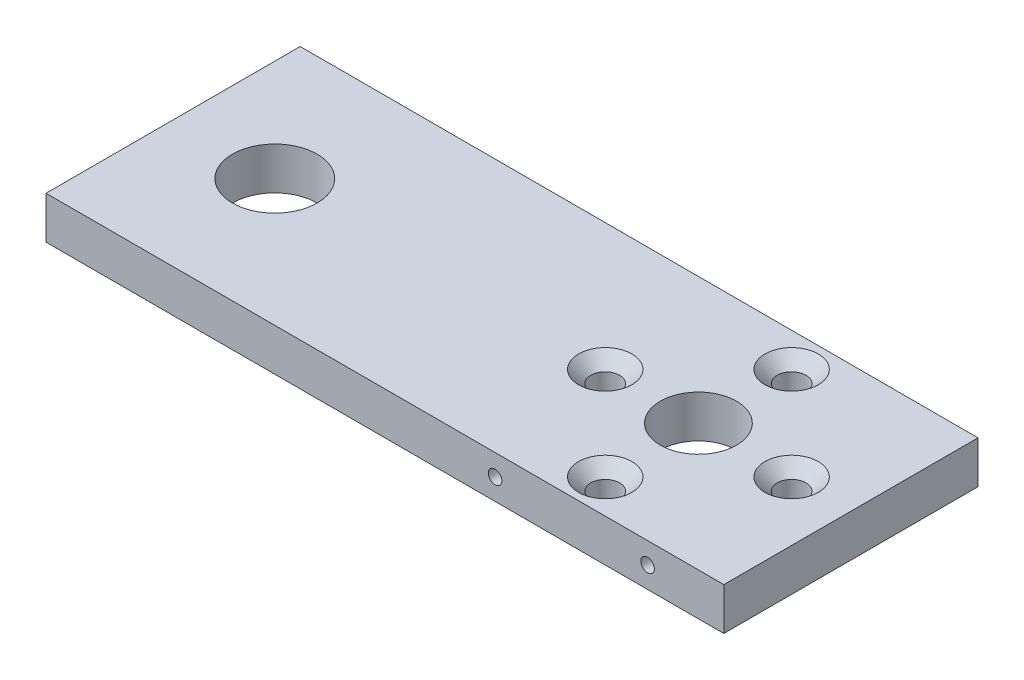
ISO-10303-21;
HEADER;
FILE_DESCRIPTION(('STEP AP214'),'2;1');
FILE_NAME('part.step','',(''),(''),'','','');
FILE_SCHEMA(('AUTOMOTIVE_DESIGN { 1 0 10303 214 1 1 1 1 }'));
ENDSEC;
DATA;
#1=APPLICATION_CONTEXT('core data for automotive mechanical design processes');
#2=APPLICATION_PROTOCOL_DEFINITION('international standard','automotive_design',2000,#1);
#3=PRODUCT_CONTEXT('',#1,'mechanical');
#4=PRODUCT('Part','Part','',(#3));
#5=PRODUCT_RELATED_PRODUCT_CATEGORY('part','',(#4));
#6=PRODUCT_DEFINITION_FORMATION('','',#4);
#7=PRODUCT_DEFINITION_CONTEXT('part definition',#1,'design');
#8=PRODUCT_DEFINITION('design','',#6,#7);
#9=PRODUCT_DEFINITION_SHAPE('','',#8);
#10=(LENGTH_UNIT() NAMED_UNIT(*) SI_UNIT(.MILLI.,.METRE.));
#11=(NAMED_UNIT(*) PLANE_ANGLE_UNIT() SI_UNIT($,.RADIAN.));
#12=(NAMED_UNIT(*) SI_UNIT($,.STERADIAN.) SOLID_ANGLE_UNIT());
#13=UNCERTAINTY_MEASURE_WITH_UNIT(LENGTH_MEASURE(1.E-05),#10,'distance_accuracy_value','');
#14=(GEOMETRIC_REPRESENTATION_CONTEXT(3) GLOBAL_UNCERTAINTY_ASSIGNED_CONTEXT((#13)) GLOBAL_UNIT_ASSIGNED_CONTEXT((#10,
#11,#12)) REPRESENTATION_CONTEXT('',''));
#15=CARTESIAN_POINT('',(0.,0.,0.));
#16=DIRECTION('',(0.,0.,1.));
#17=DIRECTION('',(1.,0.,0.));
#18=AXIS2_PLACEMENT_3D('',#15,#16,#17);
#19=CARTESIAN_POINT('',(0.,0.,0.));
#20=DIRECTION('',(0.,-1.,0.));
#21=DIRECTION('',(0.,0.,-1.));
#22=AXIS2_PLACEMENT_3D('',#19,#20,#21);
#23=PLANE('',#22);
#24=CARTESIAN_POINT('',(24.9999999999999,0.,11.));
#25=DIRECTION('',(0.,1.,0.));
#26=DIRECTION('',(0.,0.,1.));
#27=AXIS2_PLACEMENT_3D('',#24,#25,#26);
#28=CIRCLE('',#27,1.7);
#29=CARTESIAN_POINT('',(24.9999999999999,0.,12.7));
#30=VERTEX_POINT('',#29);
#31=EDGE_CURVE('E152',#30,#30,#28,.T.);
#32=ORIENTED_EDGE('',*,*,#31,.T.);
#33=EDGE_LOOP('',(#32));
#34=FACE_BOUND('',#33,.T.);
#35=CARTESIAN_POINT('',(36.,0.,0.));
#36=DIRECTION('',(0.,1.,0.));
#37=DIRECTION('',(0.,0.,1.));
#38=AXIS2_PLACEMENT_3D('',#35,#36,#37);
#39=CIRCLE('',#38,1.7);
#40=CARTESIAN_POINT('',(36.,0.,1.69999999999998));
#41=VERTEX_POINT('',#40);
#42=EDGE_CURVE('E161',#41,#41,#39,.T.);
#43=ORIENTED_EDGE('',*,*,#42,.T.);
#44=EDGE_LOOP('',(#43));
#45=FACE_BOUND('',#44,.T.);
#46=CARTESIAN_POINT('',(25.,0.,-11.));
#47=DIRECTION('',(0.,1.,0.));
#48=DIRECTION('',(0.,0.,1.));
#49=AXIS2_PLACEMENT_3D('',#46,#47,#48);
#50=CIRCLE('',#49,1.7);
#51=CARTESIAN_POINT('',(25.,0.,-9.30000000000001));
#52=VERTEX_POINT('',#51);
#53=EDGE_CURVE('E170',#52,#52,#50,.T.);
#54=ORIENTED_EDGE('',*,*,#53,.T.);
#55=EDGE_LOOP('',(#54));
#56=FACE_BOUND('',#55,.T.);
#57=CARTESIAN_POINT('',(25.,0.,0.));
#58=DIRECTION('',(0.,1.,0.));
#59=DIRECTION('',(0.,0.,1.));
#60=AXIS2_PLACEMENT_3D('',#57,#58,#59);
#61=CIRCLE('',#60,4.5);
#62=CARTESIAN_POINT('',(25.,0.,4.49999999999999));
#63=VERTEX_POINT('',#62);
#64=EDGE_CURVE('E182',#63,#63,#61,.T.);
#65=ORIENTED_EDGE('',*,*,#64,.T.);
#66=EDGE_LOOP('',(#65));
#67=FACE_BOUND('',#66,.T.);
#68=DIRECTION('',(1.,0.,0.));
#69=VECTOR('',#68,1.);
#70=CARTESIAN_POINT('',(42.9977920529291,0.,15.));
#71=LINE('',#70,#69);
#72=CARTESIAN_POINT('',(-37.0022079470709,0.,15.));
#73=VERTEX_POINT('',#72);
#74=CARTESIAN_POINT('',(42.9977920529291,0.,15.));
#75=VERTEX_POINT('',#74);
#76=EDGE_CURVE('E192',#73,#75,#71,.T.);
#77=ORIENTED_EDGE('',*,*,#76,.F.);
#78=DIRECTION('',(0.,0.,1.));
#79=VECTOR('',#78,1.);
#80=CARTESIAN_POINT('',(-37.0022079470709,0.,0.));
#81=LINE('',#80,#79);
#82=CARTESIAN_POINT('',(-37.0022079470709,0.,-15.));
#83=VERTEX_POINT('',#82);
#84=EDGE_CURVE('E196',#83,#73,#81,.T.);
#85=ORIENTED_EDGE('',*,*,#84,.F.);
#86=DIRECTION('',(-1.,0.,0.));
#87=VECTOR('',#86,1.);
#88=CARTESIAN_POINT('',(-37.0022079470709,0.,-15.));
#89=LINE('',#88,#87);
#90=CARTESIAN_POINT('',(42.9977920529291,0.,-15.));
#91=VERTEX_POINT('',#90);
#92=EDGE_CURVE('E94',#91,#83,#89,.T.);
#93=ORIENTED_EDGE('',*,*,#92,.F.);
#94=DIRECTION('',(0.,0.,-1.));
#95=VECTOR('',#94,1.);
#96=CARTESIAN_POINT('',(42.9977920529291,0.,15.));
#97=LINE('',#96,#95);
#98=EDGE_CURVE('E87',#75,#91,#97,.T.);
#99=ORIENTED_EDGE('',*,*,#98,.F.);
#100=EDGE_LOOP('',(#77,#85,#93,#99));
#101=FACE_BOUND('',#100,.T.);
#102=CARTESIAN_POINT('',(-25.,0.,0.));
#103=DIRECTION('',(0.,1.,0.));
#104=DIRECTION('',(0.,0.,1.));
#105=AXIS2_PLACEMENT_3D('',#102,#103,#104);
#106=CIRCLE('',#105,5.);
#107=CARTESIAN_POINT('',(-25.,0.,5.));
#108=VERTEX_POINT('',#107);
#109=EDGE_CURVE('E186',#108,#108,#106,.T.);
#110=ORIENTED_EDGE('',*,*,#109,.T.);
#111=EDGE_LOOP('',(#110));
#112=FACE_BOUND('',#111,.T.);
#113=CARTESIAN_POINT('',(14.,0.,0.));
#114=DIRECTION('',(0.,1.,0.));
#115=DIRECTION('',(0.,0.,1.));
#116=AXIS2_PLACEMENT_3D('',#113,#114,#115);
#117=CIRCLE('',#116,1.7);
#118=CARTESIAN_POINT('',(14.,0.,1.7));
#119=VERTEX_POINT('',#118);
#120=EDGE_CURVE('E179',#119,#119,#117,.T.);
#121=ORIENTED_EDGE('',*,*,#120,.T.);
#122=EDGE_LOOP('',(#121));
#123=FACE_BOUND('',#122,.T.);
#124=ADVANCED_FACE('F51',(#34,#45,#56,#67,#101,#112,#123),#23,.T.);
#125=CARTESIAN_POINT('',(0.,5.,0.));
#126=DIRECTION('',(0.,-1.,0.));
#127=DIRECTION('',(0.,0.,-1.));
#128=AXIS2_PLACEMENT_3D('',#125,#126,#127);
#129=PLANE('',#128);
#130=CARTESIAN_POINT('',(24.9999999999999,5.,11.));
#131=DIRECTION('',(0.,1.,0.));
#132=DIRECTION('',(0.,0.,1.));
#133=AXIS2_PLACEMENT_3D('',#130,#131,#132);
#134=CIRCLE('',#133,3.15);
#135=CARTESIAN_POINT('',(24.9999999999999,5.,14.15));
#136=VERTEX_POINT('',#135);
#137=EDGE_CURVE('E146',#136,#136,#134,.T.);
#138=ORIENTED_EDGE('',*,*,#137,.F.);
#139=EDGE_LOOP('',(#138));
#140=FACE_BOUND('',#139,.T.);
#141=CARTESIAN_POINT('',(36.,5.,0.));
#142=DIRECTION('',(0.,1.,0.));
#143=DIRECTION('',(0.,0.,1.));
#144=AXIS2_PLACEMENT_3D('',#141,#142,#143);
#145=CIRCLE('',#144,3.15);
#146=CARTESIAN_POINT('',(36.,5.,3.14999999999998));
#147=VERTEX_POINT('',#146);
#148=EDGE_CURVE('E155',#147,#147,#145,.T.);
#149=ORIENTED_EDGE('',*,*,#148,.F.);
#150=EDGE_LOOP('',(#149));
#151=FACE_BOUND('',#150,.T.);
#152=CARTESIAN_POINT('',(25.,5.,-11.));
#153=DIRECTION('',(0.,1.,0.));
#154=DIRECTION('',(0.,0.,1.));
#155=AXIS2_PLACEMENT_3D('',#152,#153,#154);
#156=CIRCLE('',#155,3.15);
#157=CARTESIAN_POINT('',(25.,5.,-7.85000000000001));
#158=VERTEX_POINT('',#157);
#159=EDGE_CURVE('E164',#158,#158,#156,.T.);
#160=ORIENTED_EDGE('',*,*,#159,.F.);
#161=EDGE_LOOP('',(#160));
#162=FACE_BOUND('',#161,.T.);
#163=CARTESIAN_POINT('',(14.,5.,0.));
#164=DIRECTION('',(0.,1.,0.));
#165=DIRECTION('',(0.,0.,1.));
#166=AXIS2_PLACEMENT_3D('',#163,#164,#165);
#167=CIRCLE('',#166,3.15);
#168=CARTESIAN_POINT('',(14.,5.,3.15));
#169=VERTEX_POINT('',#168);
#170=EDGE_CURVE('E173',#169,#169,#167,.T.);
#171=ORIENTED_EDGE('',*,*,#170,.F.);
#172=EDGE_LOOP('',(#171));
#173=FACE_BOUND('',#172,.T.);
#174=DIRECTION('',(0.,0.,1.));
#175=VECTOR('',#174,1.);
#176=CARTESIAN_POINT('',(-37.0022079470709,5.,15.));
#177=LINE('',#176,#175);
#178=CARTESIAN_POINT('',(-37.0022079470709,5.,-15.));
#179=VERTEX_POINT('',#178);
#180=CARTESIAN_POINT('',(-37.0022079470709,5.,15.));
#181=VERTEX_POINT('',#180);
#182=EDGE_CURVE('E68',#179,#181,#177,.T.);
#183=ORIENTED_EDGE('',*,*,#182,.T.);
#184=DIRECTION('',(1.,0.,0.));
#185=VECTOR('',#184,1.);
#186=CARTESIAN_POINT('',(42.9977920529291,5.,15.));
#187=LINE('',#186,#185);
#188=CARTESIAN_POINT('',(42.9977920529291,5.,15.));
#189=VERTEX_POINT('',#188);
#190=EDGE_CURVE('E100',#181,#189,#187,.T.);
#191=ORIENTED_EDGE('',*,*,#190,.T.);
#192=DIRECTION('',(0.,0.,-1.));
#193=VECTOR('',#192,1.);
#194=CARTESIAN_POINT('',(42.9977920529291,5.,15.));
#195=LINE('',#194,#193);
#196=CARTESIAN_POINT('',(42.9977920529291,5.,-15.));
#197=VERTEX_POINT('',#196);
#198=EDGE_CURVE('E198',#189,#197,#195,.T.);
#199=ORIENTED_EDGE('',*,*,#198,.T.);
#200=DIRECTION('',(-1.,0.,0.));
#201=VECTOR('',#200,1.);
#202=CARTESIAN_POINT('',(-37.0022079470709,5.,-15.));
#203=LINE('',#202,#201);
#204=EDGE_CURVE('E200',#197,#179,#203,.T.);
#205=ORIENTED_EDGE('',*,*,#204,.T.);
#206=EDGE_LOOP('',(#183,#191,#199,#205));
#207=FACE_BOUND('',#206,.T.);
#208=CARTESIAN_POINT('',(-25.,5.,0.));
#209=DIRECTION('',(0.,1.,0.));
#210=DIRECTION('',(0.,0.,1.));
#211=AXIS2_PLACEMENT_3D('',#208,#209,#210);
#212=CIRCLE('',#211,5.);
#213=CARTESIAN_POINT('',(-25.,5.,5.));
#214=VERTEX_POINT('',#213);
#215=EDGE_CURVE('E189',#214,#214,#212,.T.);
#216=ORIENTED_EDGE('',*,*,#215,.F.);
#217=EDGE_LOOP('',(#216));
#218=FACE_BOUND('',#217,.T.);
#219=CARTESIAN_POINT('',(25.,5.,0.));
#220=DIRECTION('',(0.,1.,0.));
#221=DIRECTION('',(0.,0.,1.));
#222=AXIS2_PLACEMENT_3D('',#219,#220,#221);
#223=CIRCLE('',#222,4.5);
#224=CARTESIAN_POINT('',(25.,5.,4.49999999999999));
#225=VERTEX_POINT('',#224);
#226=EDGE_CURVE('E183',#225,#225,#223,.T.);
#227=ORIENTED_EDGE('',*,*,#226,.F.);
#228=EDGE_LOOP('',(#227));
#229=FACE_BOUND('',#228,.T.);
#230=ADVANCED_FACE('F219',(#140,#151,#162,#173,#207,#218,#229),#129,.F.);
#231=CARTESIAN_POINT('',(42.9977920529291,5.,15.));
#232=DIRECTION('',(0.,0.,-1.));
#233=DIRECTION('',(-1.,0.,0.));
#234=AXIS2_PLACEMENT_3D('',#231,#232,#233);
#235=PLANE('',#234);
#236=CARTESIAN_POINT('',(15.9977920529291,2.5,15.));
#237=DIRECTION('',(0.,0.,1.));
#238=DIRECTION('',(1.,0.,0.));
#239=AXIS2_PLACEMENT_3D('',#236,#237,#238);
#240=CIRCLE('',#239,0.799999999999992);
#241=CARTESIAN_POINT('',(16.7977920529291,2.5,15.));
#242=VERTEX_POINT('',#241);
#243=EDGE_CURVE('E134',#242,#242,#240,.T.);
#244=ORIENTED_EDGE('',*,*,#243,.F.);
#245=EDGE_LOOP('',(#244));
#246=FACE_BOUND('',#245,.T.);
#247=CARTESIAN_POINT('',(33.9977920529291,2.5,15.));
#248=DIRECTION('',(0.,0.,1.));
#249=DIRECTION('',(1.,0.,0.));
#250=AXIS2_PLACEMENT_3D('',#247,#248,#249);
#251=CIRCLE('',#250,0.799999999999988);
#252=CARTESIAN_POINT('',(34.7977920529291,2.5,15.));
#253=VERTEX_POINT('',#252);
#254=EDGE_CURVE('E140',#253,#253,#251,.T.);
#255=ORIENTED_EDGE('',*,*,#254,.F.);
#256=EDGE_LOOP('',(#255));
#257=FACE_BOUND('',#256,.T.);
#258=ORIENTED_EDGE('',*,*,#76,.T.);
#259=DIRECTION('',(0.,-1.,0.));
#260=VECTOR('',#259,1.);
#261=CARTESIAN_POINT('',(42.9977920529291,5.,15.));
#262=LINE('',#261,#260);
#263=EDGE_CURVE('E60',#189,#75,#262,.T.);
#264=ORIENTED_EDGE('',*,*,#263,.F.);
#265=ORIENTED_EDGE('',*,*,#190,.F.);
#266=DIRECTION('',(0.,-1.,0.));
#267=VECTOR('',#266,1.);
#268=CARTESIAN_POINT('',(-37.0022079470709,5.,15.));
#269=LINE('',#268,#267);
#270=EDGE_CURVE('E13',#181,#73,#269,.T.);
#271=ORIENTED_EDGE('',*,*,#270,.T.);
#272=EDGE_LOOP('',(#258,#264,#265,#271));
#273=FACE_BOUND('',#272,.T.);
#274=ADVANCED_FACE('F53',(#246,#257,#273),#235,.F.);
#275=CARTESIAN_POINT('',(42.9977920529291,5.,15.));
#276=DIRECTION('',(-1.,0.,0.));
#277=DIRECTION('',(0.,0.,1.));
#278=AXIS2_PLACEMENT_3D('',#275,#276,#277);
#279=PLANE('',#278);
#280=ORIENTED_EDGE('',*,*,#98,.T.);
#281=DIRECTION('',(0.,-1.,0.));
#282=VECTOR('',#281,1.);
#283=CARTESIAN_POINT('',(42.9977920529291,5.,-15.));
#284=LINE('',#283,#282);
#285=EDGE_CURVE('E208',#197,#91,#284,.T.);
#286=ORIENTED_EDGE('',*,*,#285,.F.);
#287=ORIENTED_EDGE('',*,*,#198,.F.);
#288=ORIENTED_EDGE('',*,*,#263,.T.);
#289=EDGE_LOOP('',(#280,#286,#287,#288));
#290=FACE_BOUND('',#289,.T.);
#291=ADVANCED_FACE('F210',(#290),#279,.F.);
#292=CARTESIAN_POINT('',(-37.0022079470709,5.,-15.));
#293=DIRECTION('',(0.,0.,1.));
#294=DIRECTION('',(1.,0.,0.));
#295=AXIS2_PLACEMENT_3D('',#292,#293,#294);
#296=PLANE('',#295);
#297=CARTESIAN_POINT('',(33.9977920529291,2.5,-15.));
#298=DIRECTION('',(0.,0.,-1.));
#299=DIRECTION('',(-1.,0.,0.));
#300=AXIS2_PLACEMENT_3D('',#297,#298,#299);
#301=CIRCLE('',#300,0.799999999999988);
#302=CARTESIAN_POINT('',(33.1977920529292,2.5,-15.));
#303=VERTEX_POINT('',#302);
#304=EDGE_CURVE('E124',#303,#303,#301,.T.);
#305=ORIENTED_EDGE('',*,*,#304,.F.);
#306=EDGE_LOOP('',(#305));
#307=FACE_BOUND('',#306,.T.);
#308=CARTESIAN_POINT('',(15.9977920529291,2.5,-15.));
#309=DIRECTION('',(0.,0.,-1.));
#310=DIRECTION('',(-1.,0.,0.));
#311=AXIS2_PLACEMENT_3D('',#308,#309,#310);
#312=CIRCLE('',#311,0.799999999999992);
#313=CARTESIAN_POINT('',(15.1977920529291,2.5,-15.));
#314=VERTEX_POINT('',#313);
#315=EDGE_CURVE('E123',#314,#314,#312,.T.);
#316=ORIENTED_EDGE('',*,*,#315,.F.);
#317=EDGE_LOOP('',(#316));
#318=FACE_BOUND('',#317,.T.);
#319=ORIENTED_EDGE('',*,*,#92,.T.);
#320=DIRECTION('',(0.,-1.,0.));
#321=VECTOR('',#320,1.);
#322=CARTESIAN_POINT('',(-37.0022079470709,5.,-15.));
#323=LINE('',#322,#321);
#324=EDGE_CURVE('E202',#179,#83,#323,.T.);
#325=ORIENTED_EDGE('',*,*,#324,.F.);
#326=ORIENTED_EDGE('',*,*,#204,.F.);
#327=ORIENTED_EDGE('',*,*,#285,.T.);
#328=EDGE_LOOP('',(#319,#325,#326,#327));
#329=FACE_BOUND('',#328,.T.);
#330=ADVANCED_FACE('F217',(#307,#318,#329),#296,.F.);
#331=CARTESIAN_POINT('',(-37.0022079470709,5.,0.));
#332=DIRECTION('',(1.,0.,0.));
#333=DIRECTION('',(0.,0.,-1.));
#334=AXIS2_PLACEMENT_3D('',#331,#332,#333);
#335=PLANE('',#334);
#336=ORIENTED_EDGE('',*,*,#84,.T.);
#337=ORIENTED_EDGE('',*,*,#270,.F.);
#338=ORIENTED_EDGE('',*,*,#182,.F.);
#339=ORIENTED_EDGE('',*,*,#324,.T.);
#340=EDGE_LOOP('',(#336,#337,#338,#339));
#341=FACE_BOUND('',#340,.T.);
#342=ADVANCED_FACE('F215',(#341),#335,.F.);
#343=CARTESIAN_POINT('',(-25.,5.,0.));
#344=DIRECTION('',(0.,-1.,0.));
#345=DIRECTION('',(0.,0.,-1.));
#346=AXIS2_PLACEMENT_3D('',#343,#344,#345);
#347=CYLINDRICAL_SURFACE('',#346,5.);
#348=ORIENTED_EDGE('',*,*,#215,.T.);
#349=EDGE_LOOP('',(#348));
#350=FACE_BOUND('',#349,.T.);
#351=ORIENTED_EDGE('',*,*,#109,.F.);
#352=EDGE_LOOP('',(#351));
#353=FACE_BOUND('',#352,.T.);
#354=ADVANCED_FACE('F232',(#350,#353),#347,.F.);
#355=CARTESIAN_POINT('',(25.,5.,0.));
#356=DIRECTION('',(0.,-1.,0.));
#357=DIRECTION('',(0.,0.,-1.));
#358=AXIS2_PLACEMENT_3D('',#355,#356,#357);
#359=CYLINDRICAL_SURFACE('',#358,4.5);
#360=ORIENTED_EDGE('',*,*,#226,.T.);
#361=EDGE_LOOP('',(#360));
#362=FACE_BOUND('',#361,.T.);
#363=ORIENTED_EDGE('',*,*,#64,.F.);
#364=EDGE_LOOP('',(#363));
#365=FACE_BOUND('',#364,.T.);
#366=ADVANCED_FACE('F228',(#362,#365),#359,.F.);
#367=CARTESIAN_POINT('',(14.,5.,0.));
#368=DIRECTION('',(0.,1.,0.));
#369=DIRECTION('',(0.,0.,1.));
#370=AXIS2_PLACEMENT_3D('',#367,#368,#369);
#371=CYLINDRICAL_SURFACE('',#370,1.7);
#372=ORIENTED_EDGE('',*,*,#120,.F.);
#373=EDGE_LOOP('',(#372));
#374=FACE_BOUND('',#373,.T.);
#375=CARTESIAN_POINT('',(14.,3.55,0.));
#376=DIRECTION('',(0.,1.,0.));
#377=DIRECTION('',(0.,0.,1.));
#378=AXIS2_PLACEMENT_3D('',#375,#376,#377);
#379=CIRCLE('',#378,1.7);
#380=CARTESIAN_POINT('',(14.,3.55,1.7));
#381=VERTEX_POINT('',#380);
#382=EDGE_CURVE('E176',#381,#381,#379,.T.);
#383=ORIENTED_EDGE('',*,*,#382,.T.);
#384=EDGE_LOOP('',(#383));
#385=FACE_BOUND('',#384,.T.);
#386=ADVANCED_FACE('F231',(#374,#385),#371,.F.);
#387=CARTESIAN_POINT('',(14.,5.,0.));
#388=DIRECTION('',(0.,1.,0.));
#389=DIRECTION('',(0.,0.,1.));
#390=AXIS2_PLACEMENT_3D('',#387,#388,#389);
#391=CONICAL_SURFACE('',#390,3.15,0.785398163397448);
#392=ORIENTED_EDGE('',*,*,#382,.F.);
#393=EDGE_LOOP('',(#392));
#394=FACE_BOUND('',#393,.T.);
#395=ORIENTED_EDGE('',*,*,#170,.T.);
#396=EDGE_LOOP('',(#395));
#397=FACE_BOUND('',#396,.T.);
#398=ADVANCED_FACE('F300',(#394,#397),#391,.F.);
#399=CARTESIAN_POINT('',(25.,5.,-11.));
#400=DIRECTION('',(0.,1.,0.));
#401=DIRECTION('',(0.,0.,1.));
#402=AXIS2_PLACEMENT_3D('',#399,#400,#401);
#403=CYLINDRICAL_SURFACE('',#402,1.7);
#404=ORIENTED_EDGE('',*,*,#53,.F.);
#405=EDGE_LOOP('',(#404));
#406=FACE_BOUND('',#405,.T.);
#407=CARTESIAN_POINT('',(25.,3.55,-11.));
#408=DIRECTION('',(0.,1.,0.));
#409=DIRECTION('',(0.,0.,1.));
#410=AXIS2_PLACEMENT_3D('',#407,#408,#409);
#411=CIRCLE('',#410,1.7);
#412=CARTESIAN_POINT('',(25.,3.55,-9.30000000000001));
#413=VERTEX_POINT('',#412);
#414=EDGE_CURVE('E167',#413,#413,#411,.T.);
#415=ORIENTED_EDGE('',*,*,#414,.T.);
#416=EDGE_LOOP('',(#415));
#417=FACE_BOUND('',#416,.T.);
#418=ADVANCED_FACE('F296',(#406,#417),#403,.F.);
#419=CARTESIAN_POINT('',(25.,5.,-11.));
#420=DIRECTION('',(0.,1.,0.));
#421=DIRECTION('',(0.,0.,1.));
#422=AXIS2_PLACEMENT_3D('',#419,#420,#421);
#423=CONICAL_SURFACE('',#422,3.15,0.785398163397448);
#424=ORIENTED_EDGE('',*,*,#414,.F.);
#425=EDGE_LOOP('',(#424));
#426=FACE_BOUND('',#425,.T.);
#427=ORIENTED_EDGE('',*,*,#159,.T.);
#428=EDGE_LOOP('',(#427));
#429=FACE_BOUND('',#428,.T.);
#430=ADVANCED_FACE('F292',(#426,#429),#423,.F.);
#431=CARTESIAN_POINT('',(36.,5.,0.));
#432=DIRECTION('',(0.,1.,0.));
#433=DIRECTION('',(0.,0.,1.));
#434=AXIS2_PLACEMENT_3D('',#431,#432,#433);
#435=CYLINDRICAL_SURFACE('',#434,1.7);
#436=ORIENTED_EDGE('',*,*,#42,.F.);
#437=EDGE_LOOP('',(#436));
#438=FACE_BOUND('',#437,.T.);
#439=CARTESIAN_POINT('',(36.,3.55,0.));
#440=DIRECTION('',(0.,1.,0.));
#441=DIRECTION('',(0.,0.,1.));
#442=AXIS2_PLACEMENT_3D('',#439,#440,#441);
#443=CIRCLE('',#442,1.7);
#444=CARTESIAN_POINT('',(36.,3.55,1.69999999999998));
#445=VERTEX_POINT('',#444);
#446=EDGE_CURVE('E158',#445,#445,#443,.T.);
#447=ORIENTED_EDGE('',*,*,#446,.T.);
#448=EDGE_LOOP('',(#447));
#449=FACE_BOUND('',#448,.T.);
#450=ADVANCED_FACE('F288',(#438,#449),#435,.F.);
#451=CARTESIAN_POINT('',(36.,5.,0.));
#452=DIRECTION('',(0.,1.,0.));
#453=DIRECTION('',(0.,0.,1.));
#454=AXIS2_PLACEMENT_3D('',#451,#452,#453);
#455=CONICAL_SURFACE('',#454,3.15,0.785398163397448);
#456=ORIENTED_EDGE('',*,*,#446,.F.);
#457=EDGE_LOOP('',(#456));
#458=FACE_BOUND('',#457,.T.);
#459=ORIENTED_EDGE('',*,*,#148,.T.);
#460=EDGE_LOOP('',(#459));
#461=FACE_BOUND('',#460,.T.);
#462=ADVANCED_FACE('F284',(#458,#461),#455,.F.);
#463=CARTESIAN_POINT('',(24.9999999999999,5.,11.));
#464=DIRECTION('',(0.,1.,0.));
#465=DIRECTION('',(0.,0.,1.));
#466=AXIS2_PLACEMENT_3D('',#463,#464,#465);
#467=CYLINDRICAL_SURFACE('',#466,1.7);
#468=ORIENTED_EDGE('',*,*,#31,.F.);
#469=EDGE_LOOP('',(#468));
#470=FACE_BOUND('',#469,.T.);
#471=CARTESIAN_POINT('',(24.9999999999999,3.55,11.));
#472=DIRECTION('',(0.,1.,0.));
#473=DIRECTION('',(0.,0.,1.));
#474=AXIS2_PLACEMENT_3D('',#471,#472,#473);
#475=CIRCLE('',#474,1.7);
#476=CARTESIAN_POINT('',(24.9999999999999,3.55,12.7));
#477=VERTEX_POINT('',#476);
#478=EDGE_CURVE('E149',#477,#477,#475,.T.);
#479=ORIENTED_EDGE('',*,*,#478,.T.);
#480=EDGE_LOOP('',(#479));
#481=FACE_BOUND('',#480,.T.);
#482=ADVANCED_FACE('F280',(#470,#481),#467,.F.);
#483=CARTESIAN_POINT('',(24.9999999999999,5.,11.));
#484=DIRECTION('',(0.,1.,0.));
#485=DIRECTION('',(0.,0.,1.));
#486=AXIS2_PLACEMENT_3D('',#483,#484,#485);
#487=CONICAL_SURFACE('',#486,3.15,0.785398163397448);
#488=ORIENTED_EDGE('',*,*,#478,.F.);
#489=EDGE_LOOP('',(#488));
#490=FACE_BOUND('',#489,.T.);
#491=ORIENTED_EDGE('',*,*,#137,.T.);
#492=EDGE_LOOP('',(#491));
#493=FACE_BOUND('',#492,.T.);
#494=ADVANCED_FACE('F272',(#490,#493),#487,.F.);
#495=CARTESIAN_POINT('',(33.9977920529291,2.5,10.));
#496=DIRECTION('',(0.,0.,1.));
#497=DIRECTION('',(1.,0.,0.));
#498=AXIS2_PLACEMENT_3D('',#495,#496,#497);
#499=CONICAL_SURFACE('',#498,0.799999999999995,1.02974425867665);
#500=CARTESIAN_POINT('',(33.9977920529291,2.5,9.51931150477795));
#501=VERTEX_POINT('',#500);
#502=VERTEX_LOOP('',#501);
#503=FACE_BOUND('',#502,.T.);
#504=CARTESIAN_POINT('',(33.9977920529291,2.5,10.));
#505=DIRECTION('',(0.,0.,1.));
#506=DIRECTION('',(1.,0.,0.));
#507=AXIS2_PLACEMENT_3D('',#504,#505,#506);
#508=CIRCLE('',#507,0.799999999999995);
#509=CARTESIAN_POINT('',(34.7977920529291,2.5,10.));
#510=VERTEX_POINT('',#509);
#511=EDGE_CURVE('E143',#510,#510,#508,.T.);
#512=ORIENTED_EDGE('',*,*,#511,.T.);
#513=EDGE_LOOP('',(#512));
#514=FACE_BOUND('',#513,.T.);
#515=ADVANCED_FACE('F262',(#503,#514),#499,.F.);
#516=CARTESIAN_POINT('',(33.9977920529291,2.5,15.));
#517=DIRECTION('',(0.,0.,1.));
#518=DIRECTION('',(1.,0.,0.));
#519=AXIS2_PLACEMENT_3D('',#516,#517,#518);
#520=CYLINDRICAL_SURFACE('',#519,0.799999999999992);
#521=ORIENTED_EDGE('',*,*,#511,.F.);
#522=EDGE_LOOP('',(#521));
#523=FACE_BOUND('',#522,.T.);
#524=ORIENTED_EDGE('',*,*,#254,.T.);
#525=EDGE_LOOP('',(#524));
#526=FACE_BOUND('',#525,.T.);
#527=ADVANCED_FACE('F259',(#523,#526),#520,.F.);
#528=CARTESIAN_POINT('',(15.9977920529291,2.5,10.));
#529=DIRECTION('',(0.,0.,1.));
#530=DIRECTION('',(1.,0.,0.));
#531=AXIS2_PLACEMENT_3D('',#528,#529,#530);
#532=CONICAL_SURFACE('',#531,0.799999999999999,1.02974425867665);
#533=CARTESIAN_POINT('',(15.9977920529291,2.5,9.51931150477795));
#534=VERTEX_POINT('',#533);
#535=VERTEX_LOOP('',#534);
#536=FACE_BOUND('',#535,.T.);
#537=CARTESIAN_POINT('',(15.9977920529291,2.5,10.));
#538=DIRECTION('',(0.,0.,1.));
#539=DIRECTION('',(1.,0.,0.));
#540=AXIS2_PLACEMENT_3D('',#537,#538,#539);
#541=CIRCLE('',#540,0.799999999999999);
#542=CARTESIAN_POINT('',(16.7977920529291,2.5,10.));
#543=VERTEX_POINT('',#542);
#544=EDGE_CURVE('E137',#543,#543,#541,.T.);
#545=ORIENTED_EDGE('',*,*,#544,.T.);
#546=EDGE_LOOP('',(#545));
#547=FACE_BOUND('',#546,.T.);
#548=ADVANCED_FACE('F261',(#536,#547),#532,.F.);
#549=CARTESIAN_POINT('',(15.9977920529291,2.5,15.));
#550=DIRECTION('',(0.,0.,1.));
#551=DIRECTION('',(1.,0.,0.));
#552=AXIS2_PLACEMENT_3D('',#549,#550,#551);
#553=CYLINDRICAL_SURFACE('',#552,0.799999999999995);
#554=ORIENTED_EDGE('',*,*,#544,.F.);
#555=EDGE_LOOP('',(#554));
#556=FACE_BOUND('',#555,.T.);
#557=ORIENTED_EDGE('',*,*,#243,.T.);
#558=EDGE_LOOP('',(#557));
#559=FACE_BOUND('',#558,.T.);
#560=ADVANCED_FACE('F269',(#556,#559),#553,.F.);
#561=CARTESIAN_POINT('',(15.9977920529291,2.5,-9.99999999999999));
#562=DIRECTION('',(0.,0.,-1.));
#563=DIRECTION('',(-1.,0.,0.));
#564=AXIS2_PLACEMENT_3D('',#561,#562,#563);
#565=CONICAL_SURFACE('',#564,0.799999999999988,1.02974425867665);
#566=CARTESIAN_POINT('',(15.9977920529291,2.5,-9.51931150477795));
#567=VERTEX_POINT('',#566);
#568=VERTEX_LOOP('',#567);
#569=FACE_BOUND('',#568,.T.);
#570=CARTESIAN_POINT('',(15.9977920529291,2.5,-9.99999999999999));
#571=DIRECTION('',(0.,0.,-1.));
#572=DIRECTION('',(-1.,0.,0.));
#573=AXIS2_PLACEMENT_3D('',#570,#571,#572);
#574=CIRCLE('',#573,0.799999999999988);
#575=CARTESIAN_POINT('',(15.1977920529292,2.5,-9.99999999999999));
#576=VERTEX_POINT('',#575);
#577=EDGE_CURVE('E127',#576,#576,#574,.T.);
#578=ORIENTED_EDGE('',*,*,#577,.T.);
#579=EDGE_LOOP('',(#578));
#580=FACE_BOUND('',#579,.T.);
#581=ADVANCED_FACE('F377',(#569,#580),#565,.F.);
#582=CARTESIAN_POINT('',(15.9977920529291,2.5,-15.));
#583=DIRECTION('',(0.,0.,-1.));
#584=DIRECTION('',(-1.,0.,0.));
#585=AXIS2_PLACEMENT_3D('',#582,#583,#584);
#586=CYLINDRICAL_SURFACE('',#585,0.79999999999999);
#587=ORIENTED_EDGE('',*,*,#577,.F.);
#588=EDGE_LOOP('',(#587));
#589=FACE_BOUND('',#588,.T.);
#590=ORIENTED_EDGE('',*,*,#315,.T.);
#591=EDGE_LOOP('',(#590));
#592=FACE_BOUND('',#591,.T.);
#593=ADVANCED_FACE('F117',(#589,#592),#586,.F.);
#594=CARTESIAN_POINT('',(33.9977920529291,2.5,-9.99999999999999));
#595=DIRECTION('',(0.,0.,-1.));
#596=DIRECTION('',(-1.,0.,0.));
#597=AXIS2_PLACEMENT_3D('',#594,#595,#596);
#598=CONICAL_SURFACE('',#597,0.799999999999988,1.02974425867665);
#599=CARTESIAN_POINT('',(33.9977920529291,2.5,-9.51931150477795));
#600=VERTEX_POINT('',#599);
#601=VERTEX_LOOP('',#600);
#602=FACE_BOUND('',#601,.T.);
#603=CARTESIAN_POINT('',(33.9977920529291,2.5,-9.99999999999999));
#604=DIRECTION('',(0.,0.,-1.));
#605=DIRECTION('',(-1.,0.,0.));
#606=AXIS2_PLACEMENT_3D('',#603,#604,#605);
#607=CIRCLE('',#606,0.799999999999988);
#608=CARTESIAN_POINT('',(33.1977920529292,2.5,-9.99999999999999));
#609=VERTEX_POINT('',#608);
#610=EDGE_CURVE('E121',#609,#609,#607,.T.);
#611=ORIENTED_EDGE('',*,*,#610,.T.);
#612=EDGE_LOOP('',(#611));
#613=FACE_BOUND('',#612,.T.);
#614=ADVANCED_FACE('F113',(#602,#613),#598,.F.);
#615=CARTESIAN_POINT('',(33.9977920529291,2.5,-15.));
#616=DIRECTION('',(0.,0.,-1.));
#617=DIRECTION('',(-1.,0.,0.));
#618=AXIS2_PLACEMENT_3D('',#615,#616,#617);
#619=CYLINDRICAL_SURFACE('',#618,0.799999999999988);
#620=ORIENTED_EDGE('',*,*,#610,.F.);
#621=EDGE_LOOP('',(#620));
#622=FACE_BOUND('',#621,.T.);
#623=ORIENTED_EDGE('',*,*,#304,.T.);
#624=EDGE_LOOP('',(#623));
#625=FACE_BOUND('',#624,.T.);
#626=ADVANCED_FACE('F116',(#622,#625),#619,.F.);
#627=CLOSED_SHELL('',(#124,#230,#274,#291,#330,#342,#354,#366,#386,#398,#418,#430,#450,#462,
#482,#494,#515,#527,#548,#560,#581,#593,#614,#626));
#628=MANIFOLD_SOLID_BREP('B2',#627);
#629=ADVANCED_BREP_SHAPE_REPRESENTATION('',(#18,#628),#14);
#630=SHAPE_DEFINITION_REPRESENTATION(#9,#629);
ENDSEC;
END-ISO-10303-21;
